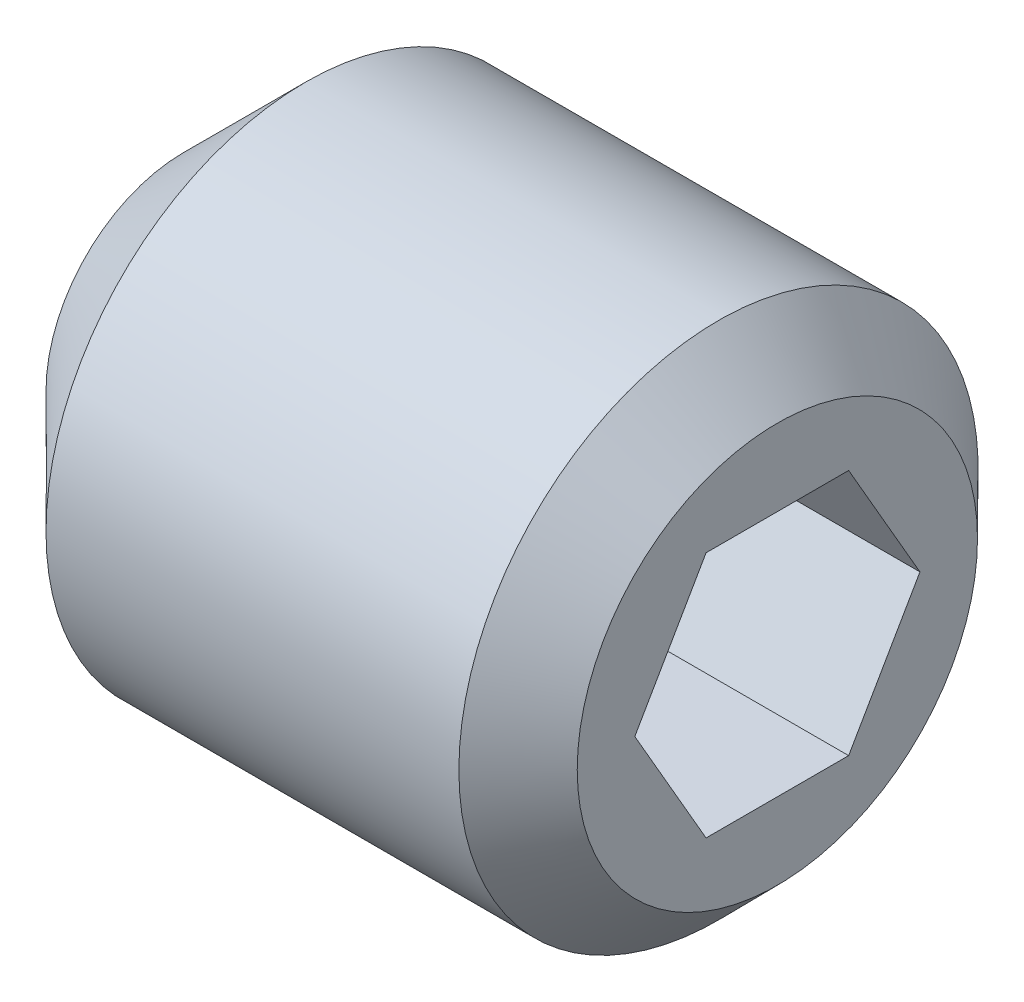
ISO-10303-21;
HEADER;
FILE_DESCRIPTION(('STEP AP214'),'2;1');
FILE_NAME('part.step','',(''),(''),'','','');
FILE_SCHEMA(('AUTOMOTIVE_DESIGN { 1 0 10303 214 1 1 1 1 }'));
ENDSEC;
DATA;
#1=APPLICATION_CONTEXT('core data for automotive mechanical design processes');
#2=APPLICATION_PROTOCOL_DEFINITION('international standard','automotive_design',2000,#1);
#3=PRODUCT_CONTEXT('',#1,'mechanical');
#4=PRODUCT('Part','Part','',(#3));
#5=PRODUCT_RELATED_PRODUCT_CATEGORY('part','',(#4));
#6=PRODUCT_DEFINITION_FORMATION('','',#4);
#7=PRODUCT_DEFINITION_CONTEXT('part definition',#1,'design');
#8=PRODUCT_DEFINITION('design','',#6,#7);
#9=PRODUCT_DEFINITION_SHAPE('','',#8);
#10=(LENGTH_UNIT() NAMED_UNIT(*) SI_UNIT(.MILLI.,.METRE.));
#11=(NAMED_UNIT(*) PLANE_ANGLE_UNIT() SI_UNIT($,.RADIAN.));
#12=(NAMED_UNIT(*) SI_UNIT($,.STERADIAN.) SOLID_ANGLE_UNIT());
#13=UNCERTAINTY_MEASURE_WITH_UNIT(LENGTH_MEASURE(1.E-05),#10,'distance_accuracy_value','');
#14=(GEOMETRIC_REPRESENTATION_CONTEXT(3) GLOBAL_UNCERTAINTY_ASSIGNED_CONTEXT((#13)) GLOBAL_UNIT_ASSIGNED_CONTEXT((#10,
#11,#12)) REPRESENTATION_CONTEXT('',''));
#15=CARTESIAN_POINT('',(0.,0.,0.));
#16=DIRECTION('',(0.,0.,1.));
#17=DIRECTION('',(1.,0.,0.));
#18=AXIS2_PLACEMENT_3D('',#15,#16,#17);
#19=CARTESIAN_POINT('',(4.762,0.,0.));
#20=DIRECTION('',(-1.,0.,0.));
#21=DIRECTION('',(0.,0.,1.));
#22=AXIS2_PLACEMENT_3D('',#19,#20,#21);
#23=CYLINDRICAL_SURFACE('',#22,2.083);
#24=CARTESIAN_POINT('',(4.29,0.,0.));
#25=DIRECTION('',(1.,0.,0.));
#26=DIRECTION('',(0.,0.,-1.));
#27=AXIS2_PLACEMENT_3D('',#24,#25,#26);
#28=CIRCLE('',#27,2.083);
#29=CARTESIAN_POINT('',(4.29,0.,2.083));
#30=VERTEX_POINT('',#29);
#31=EDGE_CURVE('E46',#30,#30,#28,.T.);
#32=CARTESIAN_POINT('',(0.978000000000003,0.,0.));
#33=DIRECTION('',(1.,0.,0.));
#34=DIRECTION('',(0.,0.,-1.));
#35=AXIS2_PLACEMENT_3D('',#32,#33,#34);
#36=CIRCLE('',#35,2.083);
#37=CARTESIAN_POINT('',(0.978000000000003,0.,2.083));
#38=VERTEX_POINT('',#37);
#39=EDGE_CURVE('E11',#38,#38,#36,.T.);
#40=CARTESIAN_POINT('',(4.29,0.,2.083));
#41=CARTESIAN_POINT('',(4.2555,0.,2.083));
#42=CARTESIAN_POINT('',(4.221,0.,2.083));
#43=CARTESIAN_POINT('',(4.152,0.,2.083));
#44=CARTESIAN_POINT('',(4.1175,0.,2.083));
#45=CARTESIAN_POINT('',(4.0485,0.,2.083));
#46=CARTESIAN_POINT('',(4.014,0.,2.083));
#47=CARTESIAN_POINT('',(3.945,0.,2.083));
#48=CARTESIAN_POINT('',(3.9105,0.,2.083));
#49=CARTESIAN_POINT('',(3.8415,0.,2.083));
#50=CARTESIAN_POINT('',(3.807,0.,2.083));
#51=CARTESIAN_POINT('',(3.738,0.,2.083));
#52=CARTESIAN_POINT('',(3.7035,0.,2.083));
#53=CARTESIAN_POINT('',(3.6345,0.,2.083));
#54=CARTESIAN_POINT('',(3.6,0.,2.083));
#55=CARTESIAN_POINT('',(3.531,0.,2.083));
#56=CARTESIAN_POINT('',(3.4965,0.,2.083));
#57=CARTESIAN_POINT('',(3.4275,0.,2.083));
#58=CARTESIAN_POINT('',(3.393,0.,2.083));
#59=CARTESIAN_POINT('',(3.324,0.,2.083));
#60=CARTESIAN_POINT('',(3.2895,0.,2.083));
#61=CARTESIAN_POINT('',(3.2205,0.,2.083));
#62=CARTESIAN_POINT('',(3.186,0.,2.083));
#63=CARTESIAN_POINT('',(3.117,0.,2.083));
#64=CARTESIAN_POINT('',(3.0825,0.,2.083));
#65=CARTESIAN_POINT('',(3.0135,0.,2.083));
#66=CARTESIAN_POINT('',(2.979,0.,2.083));
#67=CARTESIAN_POINT('',(2.91,0.,2.083));
#68=CARTESIAN_POINT('',(2.8755,0.,2.083));
#69=CARTESIAN_POINT('',(2.8065,0.,2.083));
#70=CARTESIAN_POINT('',(2.772,0.,2.083));
#71=CARTESIAN_POINT('',(2.703,0.,2.083));
#72=CARTESIAN_POINT('',(2.6685,0.,2.083));
#73=CARTESIAN_POINT('',(2.5995,0.,2.083));
#74=CARTESIAN_POINT('',(2.565,0.,2.083));
#75=CARTESIAN_POINT('',(2.496,0.,2.083));
#76=CARTESIAN_POINT('',(2.4615,0.,2.083));
#77=CARTESIAN_POINT('',(2.3925,0.,2.083));
#78=CARTESIAN_POINT('',(2.358,0.,2.083));
#79=CARTESIAN_POINT('',(2.289,0.,2.083));
#80=CARTESIAN_POINT('',(2.2545,0.,2.083));
#81=CARTESIAN_POINT('',(2.1855,0.,2.083));
#82=CARTESIAN_POINT('',(2.151,0.,2.083));
#83=CARTESIAN_POINT('',(2.082,0.,2.083));
#84=CARTESIAN_POINT('',(2.0475,0.,2.083));
#85=CARTESIAN_POINT('',(1.9785,0.,2.083));
#86=CARTESIAN_POINT('',(1.944,0.,2.083));
#87=CARTESIAN_POINT('',(1.875,0.,2.083));
#88=CARTESIAN_POINT('',(1.8405,0.,2.083));
#89=CARTESIAN_POINT('',(1.7715,0.,2.083));
#90=CARTESIAN_POINT('',(1.737,0.,2.083));
#91=CARTESIAN_POINT('',(1.668,0.,2.083));
#92=CARTESIAN_POINT('',(1.6335,0.,2.083));
#93=CARTESIAN_POINT('',(1.5645,0.,2.083));
#94=CARTESIAN_POINT('',(1.53,0.,2.083));
#95=CARTESIAN_POINT('',(1.461,0.,2.083));
#96=CARTESIAN_POINT('',(1.4265,0.,2.083));
#97=CARTESIAN_POINT('',(1.3575,0.,2.083));
#98=CARTESIAN_POINT('',(1.323,0.,2.083));
#99=CARTESIAN_POINT('',(1.254,0.,2.083));
#100=CARTESIAN_POINT('',(1.2195,0.,2.083));
#101=CARTESIAN_POINT('',(1.1505,0.,2.083));
#102=CARTESIAN_POINT('',(1.116,0.,2.083));
#103=CARTESIAN_POINT('',(1.047,0.,2.083));
#104=CARTESIAN_POINT('',(1.0125,0.,2.083));
#105=CARTESIAN_POINT('',(0.978000000000003,0.,2.083));
#106=B_SPLINE_CURVE_WITH_KNOTS('',3,(#40,#41,#42,#43,#44,#45,#46,#47,#48,#49,#50,#51,#52,#53,
#54,#55,#56,#57,#58,#59,#60,#61,#62,#63,#64,#65,#66,#67,#68,#69,#70,#71,#72,#73,#74,#75,#76,#77,
#78,#79,#80,#81,#82,#83,#84,#85,#86,#87,#88,#89,#90,#91,#92,#93,#94,#95,#96,#97,#98,#99,#100,
#101,#102,#103,#104,#105),.UNSPECIFIED.,.F.,.F.,(4,2,2,2,2,2,2,2,2,2,2,2,2,2,2,2,2,2,2,2,2,2,2,
2,2,2,2,2,2,2,2,2,4),(0.,0.1035,0.207,0.3105,0.414,0.5175,0.621,0.724499999999999,0.828,
0.931499999999999,1.035,1.1385,1.242,1.3455,1.449,1.5525,1.656,1.7595,1.863,1.9665,2.07,2.1735,
2.277,2.3805,2.484,2.5875,2.691,2.7945,2.898,3.0015,3.105,3.2085,3.312),.UNSPECIFIED.);
#107=EDGE_CURVE('BSEAM38',#30,#38,#106,.T.);
#108=ORIENTED_EDGE('',*,*,#31,.F.);
#109=ORIENTED_EDGE('',*,*,#39,.T.);
#110=ORIENTED_EDGE('',*,*,#107,.T.);
#111=ORIENTED_EDGE('',*,*,#107,.F.);
#112=EDGE_LOOP('',(#108,#110,#109,#111));
#113=FACE_BOUND('',#112,.T.);
#114=ADVANCED_FACE('F38',(#113),#23,.T.);
#115=CARTESIAN_POINT('',(0.,0.,0.));
#116=DIRECTION('',(1.,0.,0.));
#117=DIRECTION('',(0.,0.,-1.));
#118=AXIS2_PLACEMENT_3D('',#115,#116,#117);
#119=CONICAL_SURFACE('',#118,1.105,0.785398163397447);
#120=ORIENTED_EDGE('',*,*,#39,.F.);
#121=EDGE_LOOP('',(#120));
#122=FACE_BOUND('',#121,.T.);
#123=CARTESIAN_POINT('',(0.,0.,0.));
#124=DIRECTION('',(1.,0.,0.));
#125=DIRECTION('',(0.,0.,-1.));
#126=AXIS2_PLACEMENT_3D('',#123,#124,#125);
#127=CIRCLE('',#126,1.105);
#128=CARTESIAN_POINT('',(0.,0.,-1.105));
#129=VERTEX_POINT('',#128);
#130=EDGE_CURVE('E152',#129,#129,#127,.T.);
#131=ORIENTED_EDGE('',*,*,#130,.T.);
#132=EDGE_LOOP('',(#131));
#133=FACE_BOUND('',#132,.T.);
#134=ADVANCED_FACE('F178',(#122,#133),#119,.T.);
#135=CARTESIAN_POINT('',(4.29,0.,0.));
#136=DIRECTION('',(-1.,0.,0.));
#137=DIRECTION('',(0.,0.,1.));
#138=AXIS2_PLACEMENT_3D('',#135,#136,#137);
#139=CONICAL_SURFACE('',#138,2.083,0.791190620992842);
#140=CARTESIAN_POINT('',(4.762,0.,0.));
#141=DIRECTION('',(1.,0.,0.));
#142=DIRECTION('',(0.,0.,-1.));
#143=AXIS2_PLACEMENT_3D('',#140,#141,#142);
#144=CIRCLE('',#143,1.6055);
#145=CARTESIAN_POINT('',(4.762,0.,-1.6055));
#146=VERTEX_POINT('',#145);
#147=EDGE_CURVE('E167',#146,#146,#144,.T.);
#148=ORIENTED_EDGE('',*,*,#147,.F.);
#149=EDGE_LOOP('',(#148));
#150=FACE_BOUND('',#149,.T.);
#151=ORIENTED_EDGE('',*,*,#31,.T.);
#152=EDGE_LOOP('',(#151));
#153=FACE_BOUND('',#152,.T.);
#154=ADVANCED_FACE('F174',(#150,#153),#139,.T.);
#155=CARTESIAN_POINT('',(4.762,0.,0.));
#156=DIRECTION('',(1.,0.,0.));
#157=DIRECTION('',(0.,0.,-1.));
#158=AXIS2_PLACEMENT_3D('',#155,#156,#157);
#159=PLANE('',#158);
#160=DIRECTION('',(0.,0.866025403784439,0.5));
#161=VECTOR('',#160,1.);
#162=CARTESIAN_POINT('',(4.762,0.,-1.14373088326465));
#163=LINE('',#162,#161);
#164=CARTESIAN_POINT('',(4.762,0.,-1.14373088326465));
#165=VERTEX_POINT('',#164);
#166=CARTESIAN_POINT('',(4.762,0.9905,-0.571865441632324));
#167=VERTEX_POINT('',#166);
#168=EDGE_CURVE('E53',#165,#167,#163,.T.);
#169=ORIENTED_EDGE('',*,*,#168,.F.);
#170=DIRECTION('',(0.,0.866025403784439,-0.5));
#171=VECTOR('',#170,1.);
#172=CARTESIAN_POINT('',(4.762,-0.9905,-0.571865441632324));
#173=LINE('',#172,#171);
#174=CARTESIAN_POINT('',(4.762,-0.9905,-0.571865441632324));
#175=VERTEX_POINT('',#174);
#176=EDGE_CURVE('E115',#175,#165,#173,.T.);
#177=ORIENTED_EDGE('',*,*,#176,.F.);
#178=DIRECTION('',(0.,0.,-1.));
#179=VECTOR('',#178,1.);
#180=CARTESIAN_POINT('',(4.762,-0.9905,0.571865441632324));
#181=LINE('',#180,#179);
#182=CARTESIAN_POINT('',(4.762,-0.9905,0.571865441632324));
#183=VERTEX_POINT('',#182);
#184=EDGE_CURVE('E119',#183,#175,#181,.T.);
#185=ORIENTED_EDGE('',*,*,#184,.F.);
#186=DIRECTION('',(0.,-0.866025403784439,-0.5));
#187=VECTOR('',#186,1.);
#188=CARTESIAN_POINT('',(4.762,0.,1.14373088326465));
#189=LINE('',#188,#187);
#190=CARTESIAN_POINT('',(4.762,0.,1.14373088326465));
#191=VERTEX_POINT('',#190);
#192=EDGE_CURVE('E142',#191,#183,#189,.T.);
#193=ORIENTED_EDGE('',*,*,#192,.F.);
#194=DIRECTION('',(0.,-0.866025403784439,0.5));
#195=VECTOR('',#194,1.);
#196=CARTESIAN_POINT('',(4.762,0.9905,0.571865441632325));
#197=LINE('',#196,#195);
#198=CARTESIAN_POINT('',(4.762,0.9905,0.571865441632325));
#199=VERTEX_POINT('',#198);
#200=EDGE_CURVE('E138',#199,#191,#197,.T.);
#201=ORIENTED_EDGE('',*,*,#200,.F.);
#202=DIRECTION('',(0.,0.,1.));
#203=VECTOR('',#202,1.);
#204=CARTESIAN_POINT('',(4.762,0.9905,-0.571865441632324));
#205=LINE('',#204,#203);
#206=EDGE_CURVE('E135',#167,#199,#205,.T.);
#207=ORIENTED_EDGE('',*,*,#206,.F.);
#208=EDGE_LOOP('',(#169,#177,#185,#193,#201,#207));
#209=FACE_BOUND('',#208,.T.);
#210=ORIENTED_EDGE('',*,*,#147,.T.);
#211=EDGE_LOOP('',(#210));
#212=FACE_BOUND('',#211,.T.);
#213=ADVANCED_FACE('F188',(#209,#212),#159,.T.);
#214=CARTESIAN_POINT('',(0.6,0.,0.));
#215=DIRECTION('',(-1.,0.,0.));
#216=DIRECTION('',(0.,0.,1.));
#217=AXIS2_PLACEMENT_3D('',#214,#215,#216);
#218=CONICAL_SURFACE('',#217,0.,1.07335376022374);
#219=ORIENTED_EDGE('',*,*,#130,.F.);
#220=EDGE_LOOP('',(#219));
#221=FACE_BOUND('',#220,.T.);
#222=CARTESIAN_POINT('',(0.6,0.,0.));
#223=VERTEX_POINT('',#222);
#224=VERTEX_LOOP('',#223);
#225=FACE_BOUND('',#224,.T.);
#226=ADVANCED_FACE('F186',(#221,#225),#218,.F.);
#227=CARTESIAN_POINT('',(2.476,0.,-1.14373088326465));
#228=DIRECTION('',(0.,0.5,-0.866025403784438));
#229=DIRECTION('',(0.,0.866025403784439,0.5));
#230=AXIS2_PLACEMENT_3D('',#227,#228,#229);
#231=PLANE('',#230);
#232=ORIENTED_EDGE('',*,*,#168,.T.);
#233=DIRECTION('',(1.,0.,0.));
#234=VECTOR('',#233,1.);
#235=CARTESIAN_POINT('',(2.476,0.9905,-0.571865441632324));
#236=LINE('',#235,#234);
#237=CARTESIAN_POINT('',(2.476,0.9905,-0.571865441632324));
#238=VERTEX_POINT('',#237);
#239=EDGE_CURVE('E89',#238,#167,#236,.T.);
#240=ORIENTED_EDGE('',*,*,#239,.F.);
#241=DIRECTION('',(0.,0.866025403784439,0.5));
#242=VECTOR('',#241,1.);
#243=CARTESIAN_POINT('',(2.476,0.,-1.14373088326465));
#244=LINE('',#243,#242);
#245=CARTESIAN_POINT('',(2.476,0.,-1.14373088326465));
#246=VERTEX_POINT('',#245);
#247=EDGE_CURVE('E93',#246,#238,#244,.T.);
#248=ORIENTED_EDGE('',*,*,#247,.F.);
#249=DIRECTION('',(1.,0.,0.));
#250=VECTOR('',#249,1.);
#251=CARTESIAN_POINT('',(2.476,0.,-1.14373088326465));
#252=LINE('',#251,#250);
#253=EDGE_CURVE('E149',#246,#165,#252,.T.);
#254=ORIENTED_EDGE('',*,*,#253,.T.);
#255=EDGE_LOOP('',(#232,#240,#248,#254));
#256=FACE_BOUND('',#255,.T.);
#257=ADVANCED_FACE('F91',(#256),#231,.F.);
#258=CARTESIAN_POINT('',(2.476,-0.9905,-0.571865441632324));
#259=DIRECTION('',(0.,-0.5,-0.866025403784438));
#260=DIRECTION('',(0.,0.866025403784439,-0.5));
#261=AXIS2_PLACEMENT_3D('',#258,#259,#260);
#262=PLANE('',#261);
#263=ORIENTED_EDGE('',*,*,#176,.T.);
#264=ORIENTED_EDGE('',*,*,#253,.F.);
#265=DIRECTION('',(0.,0.866025403784439,-0.5));
#266=VECTOR('',#265,1.);
#267=CARTESIAN_POINT('',(2.476,-0.9905,-0.571865441632324));
#268=LINE('',#267,#266);
#269=CARTESIAN_POINT('',(2.476,-0.9905,-0.571865441632324));
#270=VERTEX_POINT('',#269);
#271=EDGE_CURVE('E100',#270,#246,#268,.T.);
#272=ORIENTED_EDGE('',*,*,#271,.F.);
#273=DIRECTION('',(1.,0.,0.));
#274=VECTOR('',#273,1.);
#275=CARTESIAN_POINT('',(2.476,-0.9905,-0.571865441632324));
#276=LINE('',#275,#274);
#277=EDGE_CURVE('E153',#270,#175,#276,.T.);
#278=ORIENTED_EDGE('',*,*,#277,.T.);
#279=EDGE_LOOP('',(#263,#264,#272,#278));
#280=FACE_BOUND('',#279,.T.);
#281=ADVANCED_FACE('F194',(#280),#262,.F.);
#282=CARTESIAN_POINT('',(2.476,-0.9905,0.571865441632324));
#283=DIRECTION('',(0.,-1.,0.));
#284=DIRECTION('',(0.,0.,-1.));
#285=AXIS2_PLACEMENT_3D('',#282,#283,#284);
#286=PLANE('',#285);
#287=ORIENTED_EDGE('',*,*,#184,.T.);
#288=ORIENTED_EDGE('',*,*,#277,.F.);
#289=DIRECTION('',(0.,0.,-1.));
#290=VECTOR('',#289,1.);
#291=CARTESIAN_POINT('',(2.476,-0.9905,0.571865441632324));
#292=LINE('',#291,#290);
#293=CARTESIAN_POINT('',(2.476,-0.9905,0.571865441632324));
#294=VERTEX_POINT('',#293);
#295=EDGE_CURVE('E128',#294,#270,#292,.T.);
#296=ORIENTED_EDGE('',*,*,#295,.F.);
#297=DIRECTION('',(1.,0.,0.));
#298=VECTOR('',#297,1.);
#299=CARTESIAN_POINT('',(2.476,-0.9905,0.571865441632324));
#300=LINE('',#299,#298);
#301=EDGE_CURVE('E156',#294,#183,#300,.T.);
#302=ORIENTED_EDGE('',*,*,#301,.T.);
#303=EDGE_LOOP('',(#287,#288,#296,#302));
#304=FACE_BOUND('',#303,.T.);
#305=ADVANCED_FACE('F231',(#304),#286,.F.);
#306=CARTESIAN_POINT('',(2.476,0.,1.14373088326465));
#307=DIRECTION('',(0.,-0.5,0.866025403784439));
#308=DIRECTION('',(0.,-0.866025403784439,-0.5));
#309=AXIS2_PLACEMENT_3D('',#306,#307,#308);
#310=PLANE('',#309);
#311=ORIENTED_EDGE('',*,*,#192,.T.);
#312=ORIENTED_EDGE('',*,*,#301,.F.);
#313=DIRECTION('',(0.,-0.866025403784439,-0.5));
#314=VECTOR('',#313,1.);
#315=CARTESIAN_POINT('',(2.476,0.,1.14373088326465));
#316=LINE('',#315,#314);
#317=CARTESIAN_POINT('',(2.476,0.,1.14373088326465));
#318=VERTEX_POINT('',#317);
#319=EDGE_CURVE('E124',#318,#294,#316,.T.);
#320=ORIENTED_EDGE('',*,*,#319,.F.);
#321=DIRECTION('',(1.,0.,0.));
#322=VECTOR('',#321,1.);
#323=CARTESIAN_POINT('',(2.476,0.,1.14373088326465));
#324=LINE('',#323,#322);
#325=EDGE_CURVE('E159',#318,#191,#324,.T.);
#326=ORIENTED_EDGE('',*,*,#325,.T.);
#327=EDGE_LOOP('',(#311,#312,#320,#326));
#328=FACE_BOUND('',#327,.T.);
#329=ADVANCED_FACE('F241',(#328),#310,.F.);
#330=CARTESIAN_POINT('',(2.476,0.9905,0.571865441632325));
#331=DIRECTION('',(0.,0.5,0.866025403784439));
#332=DIRECTION('',(0.,-0.866025403784439,0.5));
#333=AXIS2_PLACEMENT_3D('',#330,#331,#332);
#334=PLANE('',#333);
#335=ORIENTED_EDGE('',*,*,#200,.T.);
#336=ORIENTED_EDGE('',*,*,#325,.F.);
#337=DIRECTION('',(0.,-0.866025403784439,0.5));
#338=VECTOR('',#337,1.);
#339=CARTESIAN_POINT('',(2.476,0.9905,0.571865441632325));
#340=LINE('',#339,#338);
#341=CARTESIAN_POINT('',(2.476,0.9905,0.571865441632325));
#342=VERTEX_POINT('',#341);
#343=EDGE_CURVE('E109',#342,#318,#340,.T.);
#344=ORIENTED_EDGE('',*,*,#343,.F.);
#345=DIRECTION('',(1.,0.,0.));
#346=VECTOR('',#345,1.);
#347=CARTESIAN_POINT('',(2.476,0.9905,0.571865441632325));
#348=LINE('',#347,#346);
#349=EDGE_CURVE('E99',#342,#199,#348,.T.);
#350=ORIENTED_EDGE('',*,*,#349,.T.);
#351=EDGE_LOOP('',(#335,#336,#344,#350));
#352=FACE_BOUND('',#351,.T.);
#353=ADVANCED_FACE('F251',(#352),#334,.F.);
#354=CARTESIAN_POINT('',(2.476,0.9905,-0.571865441632324));
#355=DIRECTION('',(0.,1.,0.));
#356=DIRECTION('',(0.,0.,1.));
#357=AXIS2_PLACEMENT_3D('',#354,#355,#356);
#358=PLANE('',#357);
#359=ORIENTED_EDGE('',*,*,#206,.T.);
#360=ORIENTED_EDGE('',*,*,#349,.F.);
#361=DIRECTION('',(0.,0.,1.));
#362=VECTOR('',#361,1.);
#363=CARTESIAN_POINT('',(2.476,0.9905,-0.571865441632324));
#364=LINE('',#363,#362);
#365=EDGE_CURVE('E103',#238,#342,#364,.T.);
#366=ORIENTED_EDGE('',*,*,#365,.F.);
#367=ORIENTED_EDGE('',*,*,#239,.T.);
#368=EDGE_LOOP('',(#359,#360,#366,#367));
#369=FACE_BOUND('',#368,.T.);
#370=ADVANCED_FACE('F104',(#369),#358,.F.);
#371=CARTESIAN_POINT('',(2.476,0.,0.));
#372=DIRECTION('',(1.,0.,0.));
#373=DIRECTION('',(0.,0.,-1.));
#374=AXIS2_PLACEMENT_3D('',#371,#372,#373);
#375=PLANE('',#374);
#376=ORIENTED_EDGE('',*,*,#247,.T.);
#377=ORIENTED_EDGE('',*,*,#365,.T.);
#378=ORIENTED_EDGE('',*,*,#343,.T.);
#379=ORIENTED_EDGE('',*,*,#319,.T.);
#380=ORIENTED_EDGE('',*,*,#295,.T.);
#381=ORIENTED_EDGE('',*,*,#271,.T.);
#382=EDGE_LOOP('',(#376,#377,#378,#379,#380,#381));
#383=FACE_BOUND('',#382,.T.);
#384=ADVANCED_FACE('F111',(#383),#375,.T.);
#385=CLOSED_SHELL('',(#114,#134,#154,#213,#226,#257,#281,#305,#329,#353,#370,#384));
#386=MANIFOLD_SOLID_BREP('B2',#385);
#387=ADVANCED_BREP_SHAPE_REPRESENTATION('',(#18,#386),#14);
#388=SHAPE_DEFINITION_REPRESENTATION(#9,#387);
ENDSEC;
END-ISO-10303-21;
